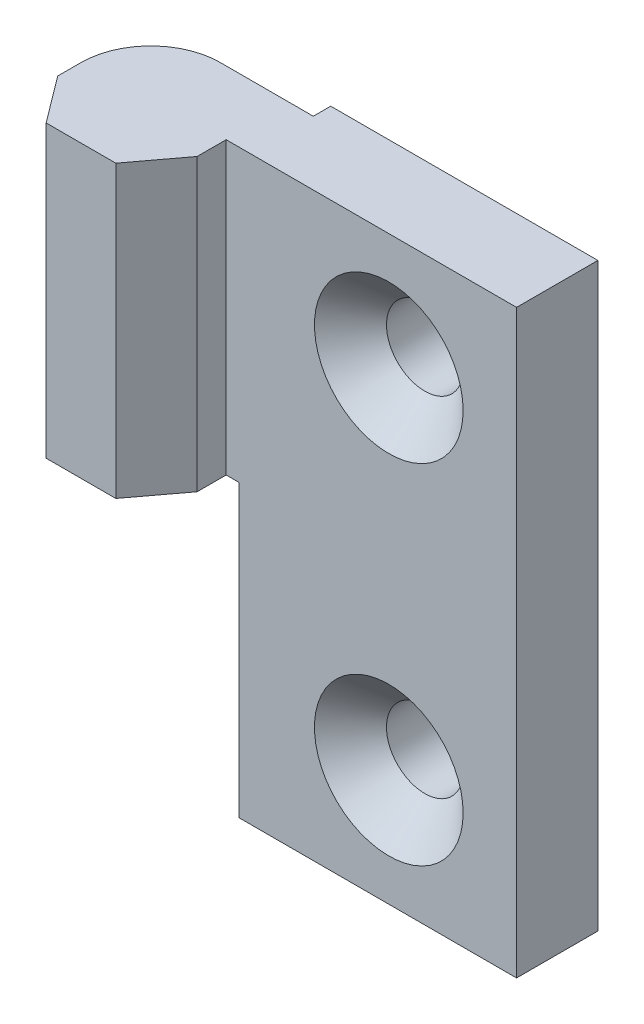
ISO-10303-21;
HEADER;
FILE_DESCRIPTION(('STEP AP214'),'2;1');
FILE_NAME('part.step','',(''),(''),'','','');
FILE_SCHEMA(('AUTOMOTIVE_DESIGN { 1 0 10303 214 1 1 1 1 }'));
ENDSEC;
DATA;
#1=APPLICATION_CONTEXT('core data for automotive mechanical design processes');
#2=APPLICATION_PROTOCOL_DEFINITION('international standard','automotive_design',2000,#1);
#3=PRODUCT_CONTEXT('',#1,'mechanical');
#4=PRODUCT('Part','Part','',(#3));
#5=PRODUCT_RELATED_PRODUCT_CATEGORY('part','',(#4));
#6=PRODUCT_DEFINITION_FORMATION('','',#4);
#7=PRODUCT_DEFINITION_CONTEXT('part definition',#1,'design');
#8=PRODUCT_DEFINITION('design','',#6,#7);
#9=PRODUCT_DEFINITION_SHAPE('','',#8);
#10=(LENGTH_UNIT() NAMED_UNIT(*) SI_UNIT(.MILLI.,.METRE.));
#11=(NAMED_UNIT(*) PLANE_ANGLE_UNIT() SI_UNIT($,.RADIAN.));
#12=(NAMED_UNIT(*) SI_UNIT($,.STERADIAN.) SOLID_ANGLE_UNIT());
#13=UNCERTAINTY_MEASURE_WITH_UNIT(LENGTH_MEASURE(1.E-05),#10,'distance_accuracy_value','');
#14=(GEOMETRIC_REPRESENTATION_CONTEXT(3) GLOBAL_UNCERTAINTY_ASSIGNED_CONTEXT((#13)) GLOBAL_UNIT_ASSIGNED_CONTEXT((#10,
#11,#12)) REPRESENTATION_CONTEXT('',''));
#15=CARTESIAN_POINT('',(0.,0.,0.));
#16=DIRECTION('',(0.,0.,1.));
#17=DIRECTION('',(1.,0.,0.));
#18=AXIS2_PLACEMENT_3D('',#15,#16,#17);
#19=CARTESIAN_POINT('',(-28.,50.,6.50000000000001));
#20=DIRECTION('',(0.,0.,-1.));
#21=DIRECTION('',(-1.,0.,0.));
#22=AXIS2_PLACEMENT_3D('',#19,#20,#21);
#23=PLANE('',#22);
#24=DIRECTION('',(-1.,0.,0.));
#25=VECTOR('',#24,1.);
#26=CARTESIAN_POINT('',(-37.,25.,6.50000000000001));
#27=LINE('',#26,#25);
#28=CARTESIAN_POINT('',(-28.,25.,6.50000000000001));
#29=VERTEX_POINT('',#28);
#30=CARTESIAN_POINT('',(-34.,25.,6.50000000000001));
#31=VERTEX_POINT('',#30);
#32=EDGE_CURVE('E259',#29,#31,#27,.T.);
#33=ORIENTED_EDGE('',*,*,#32,.F.);
#34=DIRECTION('',(0.,-1.,0.));
#35=VECTOR('',#34,1.);
#36=CARTESIAN_POINT('',(-28.,50.,6.50000000000001));
#37=LINE('',#36,#35);
#38=CARTESIAN_POINT('',(-28.,50.,6.50000000000001));
#39=VERTEX_POINT('',#38);
#40=EDGE_CURVE('E187',#39,#29,#37,.T.);
#41=ORIENTED_EDGE('',*,*,#40,.F.);
#42=DIRECTION('',(1.,0.,0.));
#43=VECTOR('',#42,1.);
#44=CARTESIAN_POINT('',(-28.,50.,6.50000000000001));
#45=LINE('',#44,#43);
#46=CARTESIAN_POINT('',(-34.,50.,6.50000000000001));
#47=VERTEX_POINT('',#46);
#48=EDGE_CURVE('E217',#47,#39,#45,.T.);
#49=ORIENTED_EDGE('',*,*,#48,.F.);
#50=DIRECTION('',(0.,-1.,0.));
#51=VECTOR('',#50,1.);
#52=CARTESIAN_POINT('',(-34.,50.,6.50000000000001));
#53=LINE('',#52,#51);
#54=EDGE_CURVE('E169',#47,#31,#53,.T.);
#55=ORIENTED_EDGE('',*,*,#54,.T.);
#56=EDGE_LOOP('',(#33,#41,#49,#55));
#57=FACE_BOUND('',#56,.T.);
#58=ADVANCED_FACE('F39',(#57),#23,.F.);
#59=CARTESIAN_POINT('',(-37.,50.,2.50000000000001));
#60=DIRECTION('',(1.,0.,0.));
#61=DIRECTION('',(0.,0.,-1.));
#62=AXIS2_PLACEMENT_3D('',#59,#60,#61);
#63=PLANE('',#62);
#64=DIRECTION('',(0.,0.,-1.));
#65=VECTOR('',#64,1.);
#66=CARTESIAN_POINT('',(-37.,25.,6.50000000000001));
#67=LINE('',#66,#65);
#68=CARTESIAN_POINT('',(-37.,25.,2.5));
#69=VERTEX_POINT('',#68);
#70=CARTESIAN_POINT('',(-37.,25.,0.500000000000004));
#71=VERTEX_POINT('',#70);
#72=EDGE_CURVE('E56',#69,#71,#67,.T.);
#73=ORIENTED_EDGE('',*,*,#72,.F.);
#74=DIRECTION('',(0.,-1.,0.));
#75=VECTOR('',#74,1.);
#76=CARTESIAN_POINT('',(-37.,50.,2.50000000000001));
#77=LINE('',#76,#75);
#78=CARTESIAN_POINT('',(-37.,50.,2.50000000000001));
#79=VERTEX_POINT('',#78);
#80=EDGE_CURVE('E165',#79,#69,#77,.T.);
#81=ORIENTED_EDGE('',*,*,#80,.F.);
#82=DIRECTION('',(0.,0.,1.));
#83=VECTOR('',#82,1.);
#84=CARTESIAN_POINT('',(-37.,50.,2.50000000000001));
#85=LINE('',#84,#83);
#86=CARTESIAN_POINT('',(-37.,50.,0.500000000000004));
#87=VERTEX_POINT('',#86);
#88=EDGE_CURVE('E221',#87,#79,#85,.T.);
#89=ORIENTED_EDGE('',*,*,#88,.F.);
#90=DIRECTION('',(0.,-1.,0.));
#91=VECTOR('',#90,1.);
#92=CARTESIAN_POINT('',(-37.,50.,0.500000000000004));
#93=LINE('',#92,#91);
#94=EDGE_CURVE('E179',#87,#71,#93,.T.);
#95=ORIENTED_EDGE('',*,*,#94,.T.);
#96=EDGE_LOOP('',(#73,#81,#89,#95));
#97=FACE_BOUND('',#96,.T.);
#98=ADVANCED_FACE('F321',(#97),#63,.F.);
#99=CARTESIAN_POINT('',(-37.,50.,-5.5));
#100=DIRECTION('',(0.,0.,1.));
#101=DIRECTION('',(1.,0.,0.));
#102=AXIS2_PLACEMENT_3D('',#99,#100,#101);
#103=PLANE('',#102);
#104=DIRECTION('',(1.,0.,0.));
#105=VECTOR('',#104,1.);
#106=CARTESIAN_POINT('',(-37.,25.,-5.5));
#107=LINE('',#106,#105);
#108=CARTESIAN_POINT('',(-31.,25.,-5.5));
#109=VERTEX_POINT('',#108);
#110=CARTESIAN_POINT('',(-23.,25.,-5.5));
#111=VERTEX_POINT('',#110);
#112=EDGE_CURVE('E132',#109,#111,#107,.T.);
#113=ORIENTED_EDGE('',*,*,#112,.F.);
#114=DIRECTION('',(0.,-1.,0.));
#115=VECTOR('',#114,1.);
#116=CARTESIAN_POINT('',(-31.,50.,-5.5));
#117=LINE('',#116,#115);
#118=CARTESIAN_POINT('',(-31.,50.,-5.5));
#119=VERTEX_POINT('',#118);
#120=EDGE_CURVE('E63',#109,#119,#117,.F.);
#121=ORIENTED_EDGE('',*,*,#120,.T.);
#122=DIRECTION('',(-1.,0.,0.));
#123=VECTOR('',#122,1.);
#124=CARTESIAN_POINT('',(-37.,50.,-5.5));
#125=LINE('',#124,#123);
#126=CARTESIAN_POINT('',(-23.,50.,-5.5));
#127=VERTEX_POINT('',#126);
#128=EDGE_CURVE('E163',#127,#119,#125,.T.);
#129=ORIENTED_EDGE('',*,*,#128,.F.);
#130=DIRECTION('',(0.,-1.,0.));
#131=VECTOR('',#130,1.);
#132=CARTESIAN_POINT('',(-23.,50.,-5.5));
#133=LINE('',#132,#131);
#134=EDGE_CURVE('E155',#127,#111,#133,.T.);
#135=ORIENTED_EDGE('',*,*,#134,.T.);
#136=EDGE_LOOP('',(#113,#121,#129,#135));
#137=FACE_BOUND('',#136,.T.);
#138=ADVANCED_FACE('F162',(#137),#103,.F.);
#139=CARTESIAN_POINT('',(-34.,50.,6.50000000000001));
#140=DIRECTION('',(0.8,0.,-0.599999999999999));
#141=DIRECTION('',(-0.6,0.,-0.800000000000001));
#142=AXIS2_PLACEMENT_3D('',#139,#140,#141);
#143=PLANE('',#142);
#144=DIRECTION('',(-0.6,0.,-0.800000000000001));
#145=VECTOR('',#144,1.);
#146=CARTESIAN_POINT('',(-34.,25.,6.50000000000001));
#147=LINE('',#146,#145);
#148=EDGE_CURVE('E248',#31,#69,#147,.T.);
#149=ORIENTED_EDGE('',*,*,#148,.F.);
#150=ORIENTED_EDGE('',*,*,#54,.F.);
#151=DIRECTION('',(0.6,0.,0.8));
#152=VECTOR('',#151,1.);
#153=CARTESIAN_POINT('',(-34.,50.,6.50000000000001));
#154=LINE('',#153,#152);
#155=EDGE_CURVE('E219',#79,#47,#154,.T.);
#156=ORIENTED_EDGE('',*,*,#155,.F.);
#157=ORIENTED_EDGE('',*,*,#80,.T.);
#158=EDGE_LOOP('',(#149,#150,#156,#157));
#159=FACE_BOUND('',#158,.T.);
#160=ADVANCED_FACE('F317',(#159),#143,.F.);
#161=CARTESIAN_POINT('',(-25.,50.,2.50000000000001));
#162=DIRECTION('',(-0.8,0.,-0.599999999999999));
#163=DIRECTION('',(-0.6,0.,0.800000000000001));
#164=AXIS2_PLACEMENT_3D('',#161,#162,#163);
#165=PLANE('',#164);
#166=DIRECTION('',(-0.6,0.,0.800000000000001));
#167=VECTOR('',#166,1.);
#168=CARTESIAN_POINT('',(-25.,25.,2.50000000000001));
#169=LINE('',#168,#167);
#170=CARTESIAN_POINT('',(-25.,25.,2.50000000000001));
#171=VERTEX_POINT('',#170);
#172=EDGE_CURVE('E252',#171,#29,#169,.T.);
#173=ORIENTED_EDGE('',*,*,#172,.F.);
#174=DIRECTION('',(0.,-1.,0.));
#175=VECTOR('',#174,1.);
#176=CARTESIAN_POINT('',(-25.,50.,2.50000000000001));
#177=LINE('',#176,#175);
#178=CARTESIAN_POINT('',(-25.,50.,2.50000000000001));
#179=VERTEX_POINT('',#178);
#180=EDGE_CURVE('E190',#179,#171,#177,.T.);
#181=ORIENTED_EDGE('',*,*,#180,.F.);
#182=DIRECTION('',(0.6,0.,-0.8));
#183=VECTOR('',#182,1.);
#184=CARTESIAN_POINT('',(-25.,50.,2.50000000000001));
#185=LINE('',#184,#183);
#186=EDGE_CURVE('E215',#39,#179,#185,.T.);
#187=ORIENTED_EDGE('',*,*,#186,.F.);
#188=ORIENTED_EDGE('',*,*,#40,.T.);
#189=EDGE_LOOP('',(#173,#181,#187,#188));
#190=FACE_BOUND('',#189,.T.);
#191=ADVANCED_FACE('F313',(#190),#165,.F.);
#192=CARTESIAN_POINT('',(-25.,50.,0.));
#193=DIRECTION('',(-1.,0.,0.));
#194=DIRECTION('',(0.,0.,1.));
#195=AXIS2_PLACEMENT_3D('',#192,#193,#194);
#196=PLANE('',#195);
#197=DIRECTION('',(0.,0.,1.));
#198=VECTOR('',#197,1.);
#199=CARTESIAN_POINT('',(-25.,25.,0.));
#200=LINE('',#199,#198);
#201=CARTESIAN_POINT('',(-25.,25.,0.));
#202=VERTEX_POINT('',#201);
#203=EDGE_CURVE('E256',#202,#171,#200,.T.);
#204=ORIENTED_EDGE('',*,*,#203,.F.);
#205=DIRECTION('',(0.,-1.,0.));
#206=VECTOR('',#205,1.);
#207=CARTESIAN_POINT('',(-25.,50.,0.));
#208=LINE('',#207,#206);
#209=CARTESIAN_POINT('',(-25.,50.,0.));
#210=VERTEX_POINT('',#209);
#211=EDGE_CURVE('E196',#210,#202,#208,.T.);
#212=ORIENTED_EDGE('',*,*,#211,.F.);
#213=DIRECTION('',(0.,0.,-1.));
#214=VECTOR('',#213,1.);
#215=CARTESIAN_POINT('',(-25.,50.,0.));
#216=LINE('',#215,#214);
#217=EDGE_CURVE('E213',#179,#210,#216,.T.);
#218=ORIENTED_EDGE('',*,*,#217,.F.);
#219=ORIENTED_EDGE('',*,*,#180,.T.);
#220=EDGE_LOOP('',(#204,#212,#218,#219));
#221=FACE_BOUND('',#220,.T.);
#222=ADVANCED_FACE('F309',(#221),#196,.F.);
#223=CARTESIAN_POINT('',(0.,50.,0.));
#224=DIRECTION('',(0.,0.,-1.));
#225=DIRECTION('',(-1.,0.,0.));
#226=AXIS2_PLACEMENT_3D('',#223,#224,#225);
#227=PLANE('',#226);
#228=CARTESIAN_POINT('',(-11.,10.,0.));
#229=DIRECTION('',(0.,0.,1.));
#230=DIRECTION('',(1.,0.,0.));
#231=AXIS2_PLACEMENT_3D('',#228,#229,#230);
#232=CIRCLE('',#231,6.4);
#233=CARTESIAN_POINT('',(-4.59999999999999,10.,0.));
#234=VERTEX_POINT('',#233);
#235=EDGE_CURVE('E235',#234,#234,#232,.T.);
#236=ORIENTED_EDGE('',*,*,#235,.F.);
#237=EDGE_LOOP('',(#236));
#238=FACE_BOUND('',#237,.T.);
#239=CARTESIAN_POINT('',(-11.,40.,0.));
#240=DIRECTION('',(0.,0.,1.));
#241=DIRECTION('',(1.,0.,0.));
#242=AXIS2_PLACEMENT_3D('',#239,#240,#241);
#243=CIRCLE('',#242,6.4);
#244=CARTESIAN_POINT('',(-4.6,40.,0.));
#245=VERTEX_POINT('',#244);
#246=EDGE_CURVE('E244',#245,#245,#243,.T.);
#247=ORIENTED_EDGE('',*,*,#246,.F.);
#248=EDGE_LOOP('',(#247));
#249=FACE_BOUND('',#248,.T.);
#250=DIRECTION('',(-1.,0.,0.));
#251=VECTOR('',#250,1.);
#252=CARTESIAN_POINT('',(0.,25.,0.));
#253=LINE('',#252,#251);
#254=CARTESIAN_POINT('',(-23.9166666666667,25.,0.));
#255=VERTEX_POINT('',#254);
#256=EDGE_CURVE('E258',#255,#202,#253,.T.);
#257=ORIENTED_EDGE('',*,*,#256,.F.);
#258=DIRECTION('',(0.,1.,0.));
#259=VECTOR('',#258,1.);
#260=CARTESIAN_POINT('',(-23.9166666666667,50.,0.));
#261=LINE('',#260,#259);
#262=CARTESIAN_POINT('',(-23.9166666666667,0.,0.));
#263=VERTEX_POINT('',#262);
#264=EDGE_CURVE('E147',#263,#255,#261,.T.);
#265=ORIENTED_EDGE('',*,*,#264,.F.);
#266=DIRECTION('',(1.,0.,0.));
#267=VECTOR('',#266,1.);
#268=CARTESIAN_POINT('',(0.,0.,0.));
#269=LINE('',#268,#267);
#270=CARTESIAN_POINT('',(0.,0.,0.));
#271=VERTEX_POINT('',#270);
#272=EDGE_CURVE('E203',#263,#271,#269,.T.);
#273=ORIENTED_EDGE('',*,*,#272,.T.);
#274=DIRECTION('',(0.,-1.,0.));
#275=VECTOR('',#274,1.);
#276=CARTESIAN_POINT('',(0.,50.,0.));
#277=LINE('',#276,#275);
#278=CARTESIAN_POINT('',(0.,50.,0.));
#279=VERTEX_POINT('',#278);
#280=EDGE_CURVE('E199',#279,#271,#277,.T.);
#281=ORIENTED_EDGE('',*,*,#280,.F.);
#282=DIRECTION('',(1.,0.,0.));
#283=VECTOR('',#282,1.);
#284=CARTESIAN_POINT('',(0.,50.,0.));
#285=LINE('',#284,#283);
#286=EDGE_CURVE('E202',#210,#279,#285,.T.);
#287=ORIENTED_EDGE('',*,*,#286,.F.);
#288=ORIENTED_EDGE('',*,*,#211,.T.);
#289=EDGE_LOOP('',(#257,#265,#273,#281,#287,#288));
#290=FACE_BOUND('',#289,.T.);
#291=ADVANCED_FACE('F305',(#238,#249,#290),#227,.F.);
#292=CARTESIAN_POINT('',(0.,0.,0.));
#293=DIRECTION('',(0.,-1.,0.));
#294=DIRECTION('',(0.,0.,-1.));
#295=AXIS2_PLACEMENT_3D('',#292,#293,#294);
#296=PLANE('',#295);
#297=ORIENTED_EDGE('',*,*,#272,.F.);
#298=DIRECTION('',(0.164398987305357,0.,-0.986393923832144));
#299=VECTOR('',#298,1.);
#300=CARTESIAN_POINT('',(-25.,0.,6.50000000000001));
#301=LINE('',#300,#299);
#302=CARTESIAN_POINT('',(-23.,0.,-5.5));
#303=VERTEX_POINT('',#302);
#304=EDGE_CURVE('E138',#263,#303,#301,.T.);
#305=ORIENTED_EDGE('',*,*,#304,.T.);
#306=DIRECTION('',(0.,0.,1.));
#307=VECTOR('',#306,1.);
#308=CARTESIAN_POINT('',(-23.,0.,-5.5));
#309=LINE('',#308,#307);
#310=CARTESIAN_POINT('',(-23.,0.,-7.));
#311=VERTEX_POINT('',#310);
#312=EDGE_CURVE('E158',#311,#303,#309,.T.);
#313=ORIENTED_EDGE('',*,*,#312,.F.);
#314=DIRECTION('',(-1.,0.,0.));
#315=VECTOR('',#314,1.);
#316=CARTESIAN_POINT('',(-23.,0.,-7.));
#317=LINE('',#316,#315);
#318=CARTESIAN_POINT('',(0.,0.,-7.));
#319=VERTEX_POINT('',#318);
#320=EDGE_CURVE('E206',#319,#311,#317,.T.);
#321=ORIENTED_EDGE('',*,*,#320,.F.);
#322=DIRECTION('',(0.,0.,-1.));
#323=VECTOR('',#322,1.);
#324=CARTESIAN_POINT('',(0.,0.,-7.));
#325=LINE('',#324,#323);
#326=EDGE_CURVE('E208',#271,#319,#325,.T.);
#327=ORIENTED_EDGE('',*,*,#326,.F.);
#328=EDGE_LOOP('',(#297,#305,#313,#321,#327));
#329=FACE_BOUND('',#328,.T.);
#330=ADVANCED_FACE('F302',(#329),#296,.T.);
#331=CARTESIAN_POINT('',(-31.,50.,0.500000000000004));
#332=DIRECTION('',(0.,-1.,0.));
#333=DIRECTION('',(0.,0.,-1.));
#334=AXIS2_PLACEMENT_3D('',#331,#332,#333);
#335=CYLINDRICAL_SURFACE('',#334,6.);
#336=ORIENTED_EDGE('',*,*,#120,.F.);
#337=CARTESIAN_POINT('',(-31.,25.,0.500000000000004));
#338=DIRECTION('',(0.,-1.,0.));
#339=DIRECTION('',(0.,0.,-1.));
#340=AXIS2_PLACEMENT_3D('',#337,#338,#339);
#341=CIRCLE('',#340,6.);
#342=EDGE_CURVE('E12',#109,#71,#341,.F.);
#343=ORIENTED_EDGE('',*,*,#342,.T.);
#344=ORIENTED_EDGE('',*,*,#94,.F.);
#345=CARTESIAN_POINT('',(-31.,50.,0.500000000000004));
#346=DIRECTION('',(0.,-1.,0.));
#347=DIRECTION('',(0.,0.,-1.));
#348=AXIS2_PLACEMENT_3D('',#345,#346,#347);
#349=CIRCLE('',#348,6.);
#350=EDGE_CURVE('E48',#119,#87,#349,.F.);
#351=ORIENTED_EDGE('',*,*,#350,.F.);
#352=EDGE_LOOP('',(#336,#343,#344,#351));
#353=FACE_BOUND('',#352,.T.);
#354=ADVANCED_FACE('F41',(#353),#335,.T.);
#355=CARTESIAN_POINT('',(0.,50.,-7.));
#356=DIRECTION('',(-1.,0.,0.));
#357=DIRECTION('',(0.,0.,1.));
#358=AXIS2_PLACEMENT_3D('',#355,#356,#357);
#359=PLANE('',#358);
#360=ORIENTED_EDGE('',*,*,#326,.T.);
#361=DIRECTION('',(0.,-1.,0.));
#362=VECTOR('',#361,1.);
#363=CARTESIAN_POINT('',(0.,50.,-7.));
#364=LINE('',#363,#362);
#365=CARTESIAN_POINT('',(0.,50.,-7.));
#366=VERTEX_POINT('',#365);
#367=EDGE_CURVE('E166',#366,#319,#364,.T.);
#368=ORIENTED_EDGE('',*,*,#367,.F.);
#369=DIRECTION('',(0.,0.,-1.));
#370=VECTOR('',#369,1.);
#371=CARTESIAN_POINT('',(0.,50.,-7.));
#372=LINE('',#371,#370);
#373=EDGE_CURVE('E205',#279,#366,#372,.T.);
#374=ORIENTED_EDGE('',*,*,#373,.F.);
#375=ORIENTED_EDGE('',*,*,#280,.T.);
#376=EDGE_LOOP('',(#360,#368,#374,#375));
#377=FACE_BOUND('',#376,.T.);
#378=ADVANCED_FACE('F363',(#377),#359,.F.);
#379=CARTESIAN_POINT('',(-23.,50.,-7.));
#380=DIRECTION('',(0.,0.,1.));
#381=DIRECTION('',(1.,0.,0.));
#382=AXIS2_PLACEMENT_3D('',#379,#380,#381);
#383=PLANE('',#382);
#384=CARTESIAN_POINT('',(-11.,40.,-7.));
#385=DIRECTION('',(0.,0.,1.));
#386=DIRECTION('',(1.,0.,0.));
#387=AXIS2_PLACEMENT_3D('',#384,#385,#386);
#388=CIRCLE('',#387,3.3);
#389=CARTESIAN_POINT('',(-7.7,40.,-7.));
#390=VERTEX_POINT('',#389);
#391=EDGE_CURVE('E238',#390,#390,#388,.T.);
#392=ORIENTED_EDGE('',*,*,#391,.T.);
#393=EDGE_LOOP('',(#392));
#394=FACE_BOUND('',#393,.T.);
#395=CARTESIAN_POINT('',(-11.,10.,-7.));
#396=DIRECTION('',(0.,0.,1.));
#397=DIRECTION('',(1.,0.,0.));
#398=AXIS2_PLACEMENT_3D('',#395,#396,#397);
#399=CIRCLE('',#398,3.3);
#400=CARTESIAN_POINT('',(-7.7,10.,-7.));
#401=VERTEX_POINT('',#400);
#402=EDGE_CURVE('E211',#401,#401,#399,.T.);
#403=ORIENTED_EDGE('',*,*,#402,.T.);
#404=EDGE_LOOP('',(#403));
#405=FACE_BOUND('',#404,.T.);
#406=ORIENTED_EDGE('',*,*,#320,.T.);
#407=DIRECTION('',(0.,-1.,0.));
#408=VECTOR('',#407,1.);
#409=CARTESIAN_POINT('',(-23.,50.,-7.));
#410=LINE('',#409,#408);
#411=CARTESIAN_POINT('',(-23.,50.,-7.));
#412=VERTEX_POINT('',#411);
#413=EDGE_CURVE('E164',#412,#311,#410,.T.);
#414=ORIENTED_EDGE('',*,*,#413,.F.);
#415=DIRECTION('',(-1.,0.,0.));
#416=VECTOR('',#415,1.);
#417=CARTESIAN_POINT('',(-23.,50.,-7.));
#418=LINE('',#417,#416);
#419=EDGE_CURVE('E226',#366,#412,#418,.T.);
#420=ORIENTED_EDGE('',*,*,#419,.F.);
#421=ORIENTED_EDGE('',*,*,#367,.T.);
#422=EDGE_LOOP('',(#406,#414,#420,#421));
#423=FACE_BOUND('',#422,.T.);
#424=ADVANCED_FACE('F334',(#394,#405,#423),#383,.F.);
#425=CARTESIAN_POINT('',(-23.,50.,-5.5));
#426=DIRECTION('',(1.,0.,0.));
#427=DIRECTION('',(0.,0.,-1.));
#428=AXIS2_PLACEMENT_3D('',#425,#426,#427);
#429=PLANE('',#428);
#430=ORIENTED_EDGE('',*,*,#312,.T.);
#431=DIRECTION('',(0.,-1.,0.));
#432=VECTOR('',#431,1.);
#433=CARTESIAN_POINT('',(-23.,25.,-5.5));
#434=LINE('',#433,#432);
#435=EDGE_CURVE('E139',#111,#303,#434,.T.);
#436=ORIENTED_EDGE('',*,*,#435,.F.);
#437=ORIENTED_EDGE('',*,*,#134,.F.);
#438=DIRECTION('',(0.,0.,1.));
#439=VECTOR('',#438,1.);
#440=CARTESIAN_POINT('',(-23.,50.,-5.5));
#441=LINE('',#440,#439);
#442=EDGE_CURVE('E224',#412,#127,#441,.T.);
#443=ORIENTED_EDGE('',*,*,#442,.F.);
#444=ORIENTED_EDGE('',*,*,#413,.T.);
#445=EDGE_LOOP('',(#430,#436,#437,#443,#444));
#446=FACE_BOUND('',#445,.T.);
#447=ADVANCED_FACE('F153',(#446),#429,.F.);
#448=CARTESIAN_POINT('',(0.,50.,0.));
#449=DIRECTION('',(0.,-1.,0.));
#450=DIRECTION('',(0.,0.,-1.));
#451=AXIS2_PLACEMENT_3D('',#448,#449,#450);
#452=PLANE('',#451);
#453=ORIENTED_EDGE('',*,*,#128,.T.);
#454=ORIENTED_EDGE('',*,*,#350,.T.);
#455=ORIENTED_EDGE('',*,*,#88,.T.);
#456=ORIENTED_EDGE('',*,*,#155,.T.);
#457=ORIENTED_EDGE('',*,*,#48,.T.);
#458=ORIENTED_EDGE('',*,*,#186,.T.);
#459=ORIENTED_EDGE('',*,*,#217,.T.);
#460=ORIENTED_EDGE('',*,*,#286,.T.);
#461=ORIENTED_EDGE('',*,*,#373,.T.);
#462=ORIENTED_EDGE('',*,*,#419,.T.);
#463=ORIENTED_EDGE('',*,*,#442,.T.);
#464=EDGE_LOOP('',(#453,#454,#455,#456,#457,#458,#459,#460,#461,#462,#463));
#465=FACE_BOUND('',#464,.T.);
#466=ADVANCED_FACE('F297',(#465),#452,.F.);
#467=CARTESIAN_POINT('',(-11.,10.,0.));
#468=DIRECTION('',(0.,0.,1.));
#469=DIRECTION('',(1.,0.,0.));
#470=AXIS2_PLACEMENT_3D('',#467,#468,#469);
#471=CYLINDRICAL_SURFACE('',#470,3.3);
#472=ORIENTED_EDGE('',*,*,#402,.F.);
#473=EDGE_LOOP('',(#472));
#474=FACE_BOUND('',#473,.T.);
#475=CARTESIAN_POINT('',(-11.,10.,-3.1));
#476=DIRECTION('',(0.,0.,1.));
#477=DIRECTION('',(1.,0.,0.));
#478=AXIS2_PLACEMENT_3D('',#475,#476,#477);
#479=CIRCLE('',#478,3.3);
#480=CARTESIAN_POINT('',(-7.69999999999999,10.,-3.1));
#481=VERTEX_POINT('',#480);
#482=EDGE_CURVE('E232',#481,#481,#479,.T.);
#483=ORIENTED_EDGE('',*,*,#482,.T.);
#484=EDGE_LOOP('',(#483));
#485=FACE_BOUND('',#484,.T.);
#486=ADVANCED_FACE('F293',(#474,#485),#471,.F.);
#487=CARTESIAN_POINT('',(-11.,10.,0.));
#488=DIRECTION('',(0.,0.,1.));
#489=DIRECTION('',(1.,0.,0.));
#490=AXIS2_PLACEMENT_3D('',#487,#488,#489);
#491=CONICAL_SURFACE('',#490,6.4,0.785398163397449);
#492=ORIENTED_EDGE('',*,*,#482,.F.);
#493=EDGE_LOOP('',(#492));
#494=FACE_BOUND('',#493,.T.);
#495=ORIENTED_EDGE('',*,*,#235,.T.);
#496=EDGE_LOOP('',(#495));
#497=FACE_BOUND('',#496,.T.);
#498=ADVANCED_FACE('F289',(#494,#497),#491,.F.);
#499=CARTESIAN_POINT('',(-11.,40.,0.));
#500=DIRECTION('',(0.,0.,1.));
#501=DIRECTION('',(1.,0.,0.));
#502=AXIS2_PLACEMENT_3D('',#499,#500,#501);
#503=CYLINDRICAL_SURFACE('',#502,3.3);
#504=ORIENTED_EDGE('',*,*,#391,.F.);
#505=EDGE_LOOP('',(#504));
#506=FACE_BOUND('',#505,.T.);
#507=CARTESIAN_POINT('',(-11.,40.,-3.1));
#508=DIRECTION('',(0.,0.,1.));
#509=DIRECTION('',(1.,0.,0.));
#510=AXIS2_PLACEMENT_3D('',#507,#508,#509);
#511=CIRCLE('',#510,3.3);
#512=CARTESIAN_POINT('',(-7.7,40.,-3.1));
#513=VERTEX_POINT('',#512);
#514=EDGE_CURVE('E241',#513,#513,#511,.T.);
#515=ORIENTED_EDGE('',*,*,#514,.T.);
#516=EDGE_LOOP('',(#515));
#517=FACE_BOUND('',#516,.T.);
#518=ADVANCED_FACE('F285',(#506,#517),#503,.F.);
#519=CARTESIAN_POINT('',(-11.,40.,0.));
#520=DIRECTION('',(0.,0.,1.));
#521=DIRECTION('',(1.,0.,0.));
#522=AXIS2_PLACEMENT_3D('',#519,#520,#521);
#523=CONICAL_SURFACE('',#522,6.4,0.785398163397449);
#524=ORIENTED_EDGE('',*,*,#514,.F.);
#525=EDGE_LOOP('',(#524));
#526=FACE_BOUND('',#525,.T.);
#527=ORIENTED_EDGE('',*,*,#246,.T.);
#528=EDGE_LOOP('',(#527));
#529=FACE_BOUND('',#528,.T.);
#530=ADVANCED_FACE('F282',(#526,#529),#523,.F.);
#531=CARTESIAN_POINT('',(-23.,0.,-5.5));
#532=DIRECTION('',(-0.986393923832144,0.,-0.164398987305357));
#533=DIRECTION('',(-0.164398987305357,0.,0.986393923832144));
#534=AXIS2_PLACEMENT_3D('',#531,#532,#533);
#535=PLANE('',#534);
#536=ORIENTED_EDGE('',*,*,#264,.T.);
#537=DIRECTION('',(0.164398987305357,0.,-0.986393923832144));
#538=VECTOR('',#537,1.);
#539=CARTESIAN_POINT('',(-25.,25.,6.50000000000001));
#540=LINE('',#539,#538);
#541=EDGE_CURVE('E135',#255,#111,#540,.T.);
#542=ORIENTED_EDGE('',*,*,#541,.T.);
#543=ORIENTED_EDGE('',*,*,#435,.T.);
#544=ORIENTED_EDGE('',*,*,#304,.F.);
#545=EDGE_LOOP('',(#536,#542,#543,#544));
#546=FACE_BOUND('',#545,.T.);
#547=ADVANCED_FACE('F143',(#546),#535,.T.);
#548=CARTESIAN_POINT('',(-23.,25.,-5.5));
#549=DIRECTION('',(0.,-1.,0.));
#550=DIRECTION('',(0.,0.,-1.));
#551=AXIS2_PLACEMENT_3D('',#548,#549,#550);
#552=PLANE('',#551);
#553=ORIENTED_EDGE('',*,*,#148,.T.);
#554=ORIENTED_EDGE('',*,*,#72,.T.);
#555=ORIENTED_EDGE('',*,*,#342,.F.);
#556=ORIENTED_EDGE('',*,*,#112,.T.);
#557=ORIENTED_EDGE('',*,*,#541,.F.);
#558=ORIENTED_EDGE('',*,*,#256,.T.);
#559=ORIENTED_EDGE('',*,*,#203,.T.);
#560=ORIENTED_EDGE('',*,*,#172,.T.);
#561=ORIENTED_EDGE('',*,*,#32,.T.);
#562=EDGE_LOOP('',(#553,#554,#555,#556,#557,#558,#559,#560,#561));
#563=FACE_BOUND('',#562,.T.);
#564=ADVANCED_FACE('F134',(#563),#552,.T.);
#565=CLOSED_SHELL('',(#58,#98,#138,#160,#191,#222,#291,#330,#354,#378,#424,#447,#466,#486,#498,
#518,#530,#547,#564));
#566=MANIFOLD_SOLID_BREP('B2',#565);
#567=ADVANCED_BREP_SHAPE_REPRESENTATION('',(#18,#566),#14);
#568=SHAPE_DEFINITION_REPRESENTATION(#9,#567);
ENDSEC;
END-ISO-10303-21;
